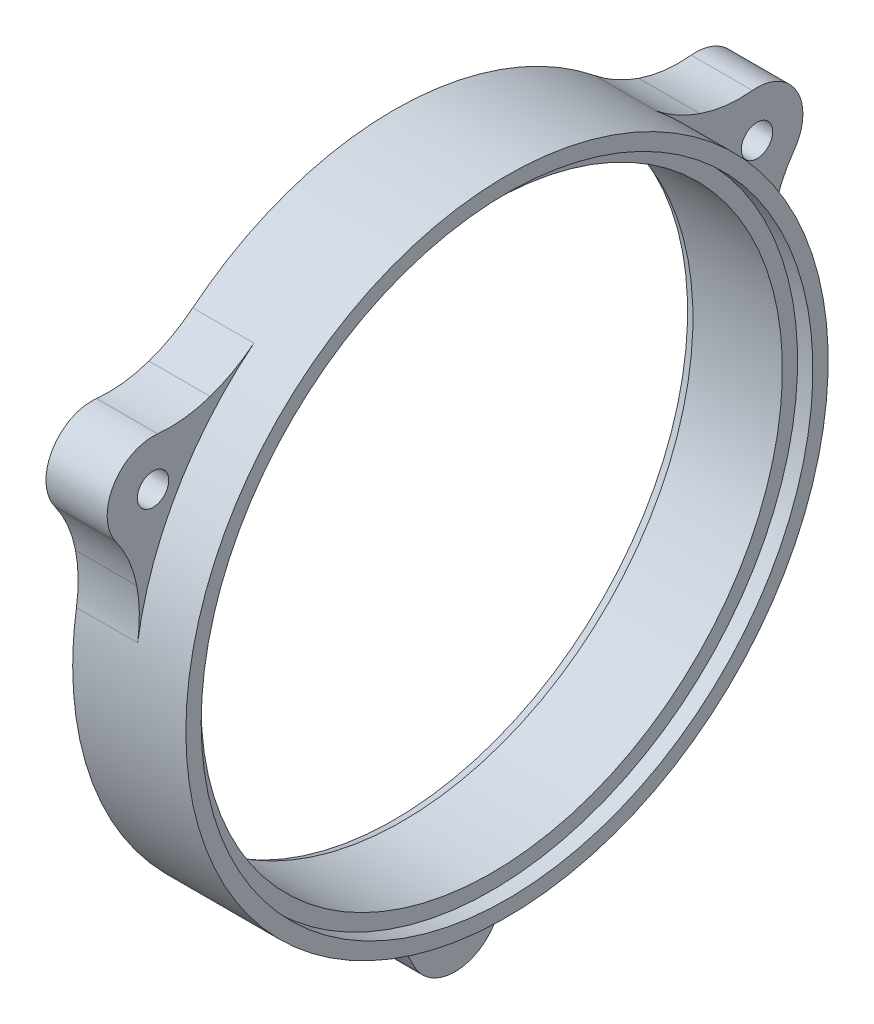
ISO-10303-21;
HEADER;
FILE_DESCRIPTION(('STEP AP214'),'2;1');
FILE_NAME('part.step','',(''),(''),'','','');
FILE_SCHEMA(('AUTOMOTIVE_DESIGN { 1 0 10303 214 1 1 1 1 }'));
ENDSEC;
DATA;
#1=APPLICATION_CONTEXT('core data for automotive mechanical design processes');
#2=APPLICATION_PROTOCOL_DEFINITION('international standard','automotive_design',2000,#1);
#3=PRODUCT_CONTEXT('',#1,'mechanical');
#4=PRODUCT('Part','Part','',(#3));
#5=PRODUCT_RELATED_PRODUCT_CATEGORY('part','',(#4));
#6=PRODUCT_DEFINITION_FORMATION('','',#4);
#7=PRODUCT_DEFINITION_CONTEXT('part definition',#1,'design');
#8=PRODUCT_DEFINITION('design','',#6,#7);
#9=PRODUCT_DEFINITION_SHAPE('','',#8);
#10=(LENGTH_UNIT() NAMED_UNIT(*) SI_UNIT(.MILLI.,.METRE.));
#11=(NAMED_UNIT(*) PLANE_ANGLE_UNIT() SI_UNIT($,.RADIAN.));
#12=(NAMED_UNIT(*) SI_UNIT($,.STERADIAN.) SOLID_ANGLE_UNIT());
#13=UNCERTAINTY_MEASURE_WITH_UNIT(LENGTH_MEASURE(1.E-05),#10,'distance_accuracy_value','');
#14=(GEOMETRIC_REPRESENTATION_CONTEXT(3) GLOBAL_UNCERTAINTY_ASSIGNED_CONTEXT((#13)) GLOBAL_UNIT_ASSIGNED_CONTEXT((#10,
#11,#12)) REPRESENTATION_CONTEXT('',''));
#15=CARTESIAN_POINT('',(0.,0.,0.));
#16=DIRECTION('',(0.,0.,1.));
#17=DIRECTION('',(1.,0.,0.));
#18=AXIS2_PLACEMENT_3D('',#15,#16,#17);
#19=CARTESIAN_POINT('',(0.,60.3504,0.));
#20=DIRECTION('',(1.,0.,0.));
#21=DIRECTION('',(0.,0.,-1.));
#22=AXIS2_PLACEMENT_3D('',#19,#20,#21);
#23=PLANE('',#22);
#24=CARTESIAN_POINT('',(0.,0.,0.));
#25=DIRECTION('',(1.,0.,0.));
#26=DIRECTION('',(0.,0.,-1.));
#27=AXIS2_PLACEMENT_3D('',#24,#25,#26);
#28=CIRCLE('',#27,60.9854);
#29=CARTESIAN_POINT('',(0.,0.,60.9854));
#30=VERTEX_POINT('',#29);
#31=EDGE_CURVE('E11',#30,#30,#28,.T.);
#32=ORIENTED_EDGE('',*,*,#31,.T.);
#33=EDGE_LOOP('',(#32));
#34=FACE_BOUND('',#33,.T.);
#35=CARTESIAN_POINT('',(0.,-72.39,5.27355936696949E-13));
#36=DIRECTION('',(-1.,0.,0.));
#37=DIRECTION('',(0.,0.,1.));
#38=AXIS2_PLACEMENT_3D('',#35,#36,#37);
#39=CIRCLE('',#38,3.2639);
#40=CARTESIAN_POINT('',(0.,-72.39,3.26390000000053));
#41=VERTEX_POINT('',#40);
#42=EDGE_CURVE('E331',#41,#41,#39,.T.);
#43=ORIENTED_EDGE('',*,*,#42,.F.);
#44=EDGE_LOOP('',(#43));
#45=FACE_BOUND('',#44,.T.);
#46=CARTESIAN_POINT('',(0.,36.1949999999998,-62.6915789799556));
#47=DIRECTION('',(-1.,0.,0.));
#48=DIRECTION('',(0.,0.,1.));
#49=AXIS2_PLACEMENT_3D('',#46,#47,#48);
#50=CIRCLE('',#49,3.2639);
#51=CARTESIAN_POINT('',(0.,36.1949999999998,-59.4276789799556));
#52=VERTEX_POINT('',#51);
#53=EDGE_CURVE('E250',#52,#52,#50,.T.);
#54=ORIENTED_EDGE('',*,*,#53,.F.);
#55=EDGE_LOOP('',(#54));
#56=FACE_BOUND('',#55,.T.);
#57=CARTESIAN_POINT('',(0.,0.,0.));
#58=DIRECTION('',(-1.,0.,0.));
#59=DIRECTION('',(0.,0.,1.));
#60=AXIS2_PLACEMENT_3D('',#57,#58,#59);
#61=CIRCLE('',#60,66.675);
#62=CARTESIAN_POINT('',(0.,10.1734653699422,-65.8942806878304));
#63=VERTEX_POINT('',#62);
#64=CARTESIAN_POINT('',(0.,-62.1528537247348,-24.1366608890236));
#65=VERTEX_POINT('',#64);
#66=EDGE_CURVE('E323',#63,#65,#61,.T.);
#67=ORIENTED_EDGE('',*,*,#66,.T.);
#68=CARTESIAN_POINT('',(0.,-90.5655868560422,-35.1705630097201));
#69=DIRECTION('',(1.,0.,0.));
#70=DIRECTION('',(0.,0.866025403784436,-0.500000000000004));
#71=AXIS2_PLACEMENT_3D('',#68,#69,#70);
#72=CIRCLE('',#71,30.4800000000001);
#73=CARTESIAN_POINT('',(0.,-67.5047313186697,-15.2399999999996));
#74=VERTEX_POINT('',#73);
#75=EDGE_CURVE('E240',#65,#74,#72,.T.);
#76=ORIENTED_EDGE('',*,*,#75,.T.);
#77=CARTESIAN_POINT('',(0.,-86.7221109331468,-31.8488025081));
#78=DIRECTION('',(1.,0.,0.));
#79=DIRECTION('',(0.,-0.866025403784436,0.500000000000004));
#80=AXIS2_PLACEMENT_3D('',#77,#78,#79);
#81=CIRCLE('',#80,25.4000000000001);
#82=CARTESIAN_POINT('',(0.,-76.2987575272218,-8.6860370476634));
#83=VERTEX_POINT('',#82);
#84=EDGE_CURVE('E243',#74,#83,#81,.T.);
#85=ORIENTED_EDGE('',*,*,#84,.T.);
#86=CARTESIAN_POINT('',(0.,-72.39,5.27355936696949E-13));
#87=DIRECTION('',(-1.,0.,0.));
#88=DIRECTION('',(0.,0.866025403784436,-0.500000000000004));
#89=AXIS2_PLACEMENT_3D('',#86,#87,#88);
#90=CIRCLE('',#89,9.52500000000012);
#91=CARTESIAN_POINT('',(0.,-76.2987575272218,8.6860370476644));
#92=VERTEX_POINT('',#91);
#93=EDGE_CURVE('E222',#83,#92,#90,.T.);
#94=ORIENTED_EDGE('',*,*,#93,.T.);
#95=CARTESIAN_POINT('',(0.,-86.7221109331463,31.848802508101));
#96=DIRECTION('',(1.,0.,0.));
#97=DIRECTION('',(0.,0.866025403784436,-0.500000000000004));
#98=AXIS2_PLACEMENT_3D('',#95,#96,#97);
#99=CIRCLE('',#98,25.4);
#100=CARTESIAN_POINT('',(0.,-67.5047313186694,15.2400000000005));
#101=VERTEX_POINT('',#100);
#102=EDGE_CURVE('E209',#92,#101,#99,.T.);
#103=ORIENTED_EDGE('',*,*,#102,.T.);
#104=CARTESIAN_POINT('',(0.,-90.5655868560417,35.1705630097211));
#105=DIRECTION('',(1.,0.,0.));
#106=DIRECTION('',(0.,-0.866025403784436,0.500000000000004));
#107=AXIS2_PLACEMENT_3D('',#104,#105,#106);
#108=CIRCLE('',#107,30.48);
#109=CARTESIAN_POINT('',(0.,-62.1528537247345,24.1366608890243));
#110=VERTEX_POINT('',#109);
#111=EDGE_CURVE('E56',#101,#110,#108,.T.);
#112=ORIENTED_EDGE('',*,*,#111,.T.);
#113=CARTESIAN_POINT('',(0.,10.173465369943,65.8942806878304));
#114=VERTEX_POINT('',#113);
#115=EDGE_CURVE('E326',#110,#114,#61,.T.);
#116=ORIENTED_EDGE('',*,*,#115,.T.);
#117=CARTESIAN_POINT('',(0.,14.8241923962027,96.0173804308386));
#118=DIRECTION('',(1.,0.,0.));
#119=DIRECTION('',(0.,-0.866025403784443,-0.499999999999992));
#120=AXIS2_PLACEMENT_3D('',#117,#118,#119);
#121=CIRCLE('',#120,30.4800000000001);
#122=CARTESIAN_POINT('',(0.,20.5541385056607,66.0808121976106));
#123=VERTEX_POINT('',#122);
#124=EDGE_CURVE('E203',#114,#123,#121,.T.);
#125=ORIENTED_EDGE('',*,*,#124,.T.);
#126=CARTESIAN_POINT('',(0.,15.7791834144456,91.0279523919672));
#127=DIRECTION('',(1.,0.,0.));
#128=DIRECTION('',(0.,0.866025403784443,0.499999999999992));
#129=AXIS2_PLACEMENT_3D('',#126,#127,#128);
#130=CIRCLE('',#129,25.4000000000001);
#131=CARTESIAN_POINT('',(0.,30.6270500221219,70.4196808195948));
#132=VERTEX_POINT('',#131);
#133=EDGE_CURVE('E186',#123,#132,#130,.T.);
#134=ORIENTED_EDGE('',*,*,#133,.T.);
#135=CARTESIAN_POINT('',(0.,36.1950000000007,62.6915789799551));
#136=DIRECTION('',(-1.,0.,0.));
#137=DIRECTION('',(0.,-0.866025403784443,-0.499999999999992));
#138=AXIS2_PLACEMENT_3D('',#135,#136,#137);
#139=CIRCLE('',#138,9.52500000000012);
#140=CARTESIAN_POINT('',(0.,45.6717075051013,61.7336437719308));
#141=VERTEX_POINT('',#140);
#142=EDGE_CURVE('E183',#132,#141,#139,.T.);
#143=ORIENTED_EDGE('',*,*,#142,.T.);
#144=CARTESIAN_POINT('',(0.,70.9429275187025,59.1791498838661));
#145=DIRECTION('',(1.,0.,0.));
#146=DIRECTION('',(0.,-0.866025403784443,-0.499999999999992));
#147=AXIS2_PLACEMENT_3D('',#144,#145,#146);
#148=CIRCLE('',#147,25.4);
#149=CARTESIAN_POINT('',(0.,46.9505928130102,50.8408121976102));
#150=VERTEX_POINT('',#149);
#151=EDGE_CURVE('E200',#141,#150,#148,.T.);
#152=ORIENTED_EDGE('',*,*,#151,.T.);
#153=CARTESIAN_POINT('',(0.,75.7413944598409,60.8468174211173));
#154=DIRECTION('',(1.,0.,0.));
#155=DIRECTION('',(0.,0.866025403784443,0.499999999999992));
#156=AXIS2_PLACEMENT_3D('',#153,#154,#155);
#157=CIRCLE('',#156,30.48);
#158=CARTESIAN_POINT('',(0.,51.9793883547928,41.757619798806));
#159=VERTEX_POINT('',#158);
#160=EDGE_CURVE('E49',#150,#159,#157,.T.);
#161=ORIENTED_EDGE('',*,*,#160,.T.);
#162=CARTESIAN_POINT('',(0.,51.9793883547924,-41.7576197988066));
#163=VERTEX_POINT('',#162);
#164=EDGE_CURVE('E322',#159,#163,#61,.T.);
#165=ORIENTED_EDGE('',*,*,#164,.T.);
#166=CARTESIAN_POINT('',(0.,75.7413944598402,-60.8468174211182));
#167=DIRECTION('',(1.,0.,0.));
#168=DIRECTION('',(0.,0.,1.));
#169=AXIS2_PLACEMENT_3D('',#166,#167,#168);
#170=CIRCLE('',#169,30.4800000000001);
#171=CARTESIAN_POINT('',(0.,46.9505928130095,-50.8408121976109));
#172=VERTEX_POINT('',#171);
#173=EDGE_CURVE('E289',#163,#172,#170,.T.);
#174=ORIENTED_EDGE('',*,*,#173,.T.);
#175=CARTESIAN_POINT('',(0.,70.9429275187018,-59.179149883867));
#176=DIRECTION('',(1.,0.,0.));
#177=DIRECTION('',(0.,0.,-1.));
#178=AXIS2_PLACEMENT_3D('',#175,#176,#177);
#179=CIRCLE('',#178,25.4000000000001);
#180=CARTESIAN_POINT('',(0.,45.6717075051005,-61.7336437719313));
#181=VERTEX_POINT('',#180);
#182=EDGE_CURVE('E292',#172,#181,#179,.T.);
#183=ORIENTED_EDGE('',*,*,#182,.T.);
#184=CARTESIAN_POINT('',(0.,36.1949999999998,-62.6915789799556));
#185=DIRECTION('',(-1.,0.,0.));
#186=DIRECTION('',(0.,0.,1.));
#187=AXIS2_PLACEMENT_3D('',#184,#185,#186);
#188=CIRCLE('',#187,9.52500000000012);
#189=CARTESIAN_POINT('',(0.,30.6270500221211,-70.4196808195953));
#190=VERTEX_POINT('',#189);
#191=EDGE_CURVE('E268',#181,#190,#188,.T.);
#192=ORIENTED_EDGE('',*,*,#191,.T.);
#193=CARTESIAN_POINT('',(0.,15.7791834144446,-91.0279523919674));
#194=DIRECTION('',(1.,0.,0.));
#195=DIRECTION('',(0.,0.,1.));
#196=AXIS2_PLACEMENT_3D('',#193,#194,#195);
#197=CIRCLE('',#196,25.4);
#198=CARTESIAN_POINT('',(0.,20.5541385056597,-66.0808121976109));
#199=VERTEX_POINT('',#198);
#200=EDGE_CURVE('E284',#190,#199,#197,.T.);
#201=ORIENTED_EDGE('',*,*,#200,.T.);
#202=CARTESIAN_POINT('',(0.,14.8241923962015,-96.0173804308387));
#203=DIRECTION('',(1.,0.,0.));
#204=DIRECTION('',(0.,0.,-1.));
#205=AXIS2_PLACEMENT_3D('',#202,#203,#204);
#206=CIRCLE('',#205,30.48);
#207=EDGE_CURVE('E287',#199,#63,#206,.T.);
#208=ORIENTED_EDGE('',*,*,#207,.T.);
#209=EDGE_LOOP('',(#67,#76,#85,#94,#103,#112,#116,#125,#134,#143,#152,#161,#165,#174,#183,#192,
#201,#208));
#210=FACE_BOUND('',#209,.T.);
#211=CARTESIAN_POINT('',(0.,36.1950000000007,62.6915789799551));
#212=DIRECTION('',(-1.,0.,0.));
#213=DIRECTION('',(0.,0.,1.));
#214=AXIS2_PLACEMENT_3D('',#211,#212,#213);
#215=CIRCLE('',#214,3.2639);
#216=CARTESIAN_POINT('',(0.,36.1950000000007,65.9554789799551));
#217=VERTEX_POINT('',#216);
#218=EDGE_CURVE('E332',#217,#217,#215,.T.);
#219=ORIENTED_EDGE('',*,*,#218,.F.);
#220=EDGE_LOOP('',(#219));
#221=FACE_BOUND('',#220,.T.);
#222=ADVANCED_FACE('F34',(#34,#45,#56,#210,#221),#23,.F.);
#223=CARTESIAN_POINT('',(0.,0.,0.));
#224=DIRECTION('',(-1.,0.,0.));
#225=DIRECTION('',(0.,0.,1.));
#226=AXIS2_PLACEMENT_3D('',#223,#224,#225);
#227=CYLINDRICAL_SURFACE('',#226,66.675);
#228=CARTESIAN_POINT('',(12.7,0.,0.));
#229=DIRECTION('',(1.,0.,0.));
#230=DIRECTION('',(0.,0.866025403784443,0.499999999999992));
#231=AXIS2_PLACEMENT_3D('',#228,#229,#230);
#232=CIRCLE('',#231,66.675);
#233=CARTESIAN_POINT('',(12.7,51.9793883547928,41.757619798806));
#234=VERTEX_POINT('',#233);
#235=CARTESIAN_POINT('',(12.7,10.173465369943,65.8942806878304));
#236=VERTEX_POINT('',#235);
#237=EDGE_CURVE('E179',#234,#236,#232,.T.);
#238=ORIENTED_EDGE('',*,*,#237,.T.);
#239=DIRECTION('',(-1.,0.,0.));
#240=VECTOR('',#239,1.);
#241=CARTESIAN_POINT('',(12.7,10.173465369943,65.8942806878304));
#242=LINE('',#241,#240);
#243=EDGE_CURVE('E214',#236,#114,#242,.T.);
#244=ORIENTED_EDGE('',*,*,#243,.T.);
#245=ORIENTED_EDGE('',*,*,#115,.F.);
#246=DIRECTION('',(-1.,0.,0.));
#247=VECTOR('',#246,1.);
#248=CARTESIAN_POINT('',(12.7,-62.1528537247345,24.1366608890243));
#249=LINE('',#248,#247);
#250=CARTESIAN_POINT('',(12.7,-62.1528537247345,24.1366608890243));
#251=VERTEX_POINT('',#250);
#252=EDGE_CURVE('E258',#251,#110,#249,.T.);
#253=ORIENTED_EDGE('',*,*,#252,.F.);
#254=CARTESIAN_POINT('',(12.7,0.,0.));
#255=DIRECTION('',(1.,0.,0.));
#256=DIRECTION('',(0.,-0.866025403784436,0.500000000000004));
#257=AXIS2_PLACEMENT_3D('',#254,#255,#256);
#258=CIRCLE('',#257,66.675);
#259=CARTESIAN_POINT('',(12.7,-62.1528537247348,-24.1366608890236));
#260=VERTEX_POINT('',#259);
#261=EDGE_CURVE('E225',#251,#260,#258,.T.);
#262=ORIENTED_EDGE('',*,*,#261,.T.);
#263=DIRECTION('',(-1.,0.,0.));
#264=VECTOR('',#263,1.);
#265=CARTESIAN_POINT('',(12.7,-62.1528537247348,-24.1366608890236));
#266=LINE('',#265,#264);
#267=EDGE_CURVE('E255',#260,#65,#266,.T.);
#268=ORIENTED_EDGE('',*,*,#267,.T.);
#269=ORIENTED_EDGE('',*,*,#66,.F.);
#270=DIRECTION('',(-1.,0.,0.));
#271=VECTOR('',#270,1.);
#272=CARTESIAN_POINT('',(12.7,10.1734653699422,-65.8942806878305));
#273=LINE('',#272,#271);
#274=CARTESIAN_POINT('',(12.7,10.1734653699422,-65.8942806878305));
#275=VERTEX_POINT('',#274);
#276=EDGE_CURVE('E307',#275,#63,#273,.T.);
#277=ORIENTED_EDGE('',*,*,#276,.F.);
#278=CARTESIAN_POINT('',(12.7,0.,0.));
#279=DIRECTION('',(1.,0.,0.));
#280=DIRECTION('',(0.,0.,-1.));
#281=AXIS2_PLACEMENT_3D('',#278,#279,#280);
#282=CIRCLE('',#281,66.675);
#283=CARTESIAN_POINT('',(12.7,51.9793883547924,-41.7576197988066));
#284=VERTEX_POINT('',#283);
#285=EDGE_CURVE('E271',#275,#284,#282,.T.);
#286=ORIENTED_EDGE('',*,*,#285,.T.);
#287=DIRECTION('',(-1.,0.,0.));
#288=VECTOR('',#287,1.);
#289=CARTESIAN_POINT('',(12.7,51.9793883547924,-41.7576197988066));
#290=LINE('',#289,#288);
#291=EDGE_CURVE('E304',#284,#163,#290,.T.);
#292=ORIENTED_EDGE('',*,*,#291,.T.);
#293=ORIENTED_EDGE('',*,*,#164,.F.);
#294=DIRECTION('',(-1.,0.,0.));
#295=VECTOR('',#294,1.);
#296=CARTESIAN_POINT('',(12.7,51.9793883547928,41.757619798806));
#297=LINE('',#296,#295);
#298=EDGE_CURVE('E168',#234,#159,#297,.T.);
#299=ORIENTED_EDGE('',*,*,#298,.F.);
#300=EDGE_LOOP('',(#238,#244,#245,#253,#262,#268,#269,#277,#286,#292,#293,#299));
#301=FACE_BOUND('',#300,.T.);
#302=CARTESIAN_POINT('',(23.495,0.,0.));
#303=DIRECTION('',(-1.,0.,0.));
#304=DIRECTION('',(0.,0.,1.));
#305=AXIS2_PLACEMENT_3D('',#302,#303,#304);
#306=CIRCLE('',#305,66.675);
#307=CARTESIAN_POINT('',(23.495,0.,66.675));
#308=VERTEX_POINT('',#307);
#309=EDGE_CURVE('E319',#308,#308,#306,.T.);
#310=ORIENTED_EDGE('',*,*,#309,.T.);
#311=EDGE_LOOP('',(#310));
#312=FACE_BOUND('',#311,.T.);
#313=ADVANCED_FACE('F350',(#301,#312),#227,.T.);
#314=CARTESIAN_POINT('',(23.495,66.675,0.));
#315=DIRECTION('',(-1.,0.,0.));
#316=DIRECTION('',(0.,0.,1.));
#317=AXIS2_PLACEMENT_3D('',#314,#315,#316);
#318=PLANE('',#317);
#319=ORIENTED_EDGE('',*,*,#309,.F.);
#320=EDGE_LOOP('',(#319));
#321=FACE_BOUND('',#320,.T.);
#322=CARTESIAN_POINT('',(23.495,0.,0.));
#323=DIRECTION('',(-1.,0.,0.));
#324=DIRECTION('',(0.,0.,1.));
#325=AXIS2_PLACEMENT_3D('',#322,#323,#324);
#326=CIRCLE('',#325,63.5);
#327=CARTESIAN_POINT('',(23.495,0.,63.5));
#328=VERTEX_POINT('',#327);
#329=EDGE_CURVE('E316',#328,#328,#326,.T.);
#330=ORIENTED_EDGE('',*,*,#329,.T.);
#331=EDGE_LOOP('',(#330));
#332=FACE_BOUND('',#331,.T.);
#333=ADVANCED_FACE('F355',(#321,#332),#318,.F.);
#334=CARTESIAN_POINT('',(0.,0.,0.));
#335=DIRECTION('',(-1.,0.,0.));
#336=DIRECTION('',(0.,0.,1.));
#337=AXIS2_PLACEMENT_3D('',#334,#335,#336);
#338=CYLINDRICAL_SURFACE('',#337,63.5);
#339=ORIENTED_EDGE('',*,*,#329,.F.);
#340=EDGE_LOOP('',(#339));
#341=FACE_BOUND('',#340,.T.);
#342=CARTESIAN_POINT('',(20.32,0.,0.));
#343=DIRECTION('',(-1.,0.,0.));
#344=DIRECTION('',(0.,0.,1.));
#345=AXIS2_PLACEMENT_3D('',#342,#343,#344);
#346=CIRCLE('',#345,63.5);
#347=CARTESIAN_POINT('',(20.32,0.,63.5));
#348=VERTEX_POINT('',#347);
#349=EDGE_CURVE('E313',#348,#348,#346,.T.);
#350=ORIENTED_EDGE('',*,*,#349,.T.);
#351=EDGE_LOOP('',(#350));
#352=FACE_BOUND('',#351,.T.);
#353=ADVANCED_FACE('F362',(#341,#352),#338,.F.);
#354=CARTESIAN_POINT('',(20.32,63.5,0.));
#355=DIRECTION('',(-1.,0.,0.));
#356=DIRECTION('',(0.,0.,1.));
#357=AXIS2_PLACEMENT_3D('',#354,#355,#356);
#358=PLANE('',#357);
#359=ORIENTED_EDGE('',*,*,#349,.F.);
#360=EDGE_LOOP('',(#359));
#361=FACE_BOUND('',#360,.T.);
#362=CARTESIAN_POINT('',(20.32,0.,0.));
#363=DIRECTION('',(-1.,0.,0.));
#364=DIRECTION('',(0.,0.,1.));
#365=AXIS2_PLACEMENT_3D('',#362,#363,#364);
#366=CIRCLE('',#365,60.3504);
#367=CARTESIAN_POINT('',(20.32,0.,60.3504));
#368=VERTEX_POINT('',#367);
#369=EDGE_CURVE('E299',#368,#368,#366,.T.);
#370=ORIENTED_EDGE('',*,*,#369,.T.);
#371=EDGE_LOOP('',(#370));
#372=FACE_BOUND('',#371,.T.);
#373=ADVANCED_FACE('F366',(#361,#372),#358,.F.);
#374=CARTESIAN_POINT('',(0.,0.,0.));
#375=DIRECTION('',(-1.,0.,0.));
#376=DIRECTION('',(0.,0.,1.));
#377=AXIS2_PLACEMENT_3D('',#374,#375,#376);
#378=CYLINDRICAL_SURFACE('',#377,60.3504);
#379=CARTESIAN_POINT('',(1.74464816135372,0.,0.));
#380=DIRECTION('',(1.,0.,0.));
#381=DIRECTION('',(0.,0.,-1.));
#382=AXIS2_PLACEMENT_3D('',#379,#380,#381);
#383=CIRCLE('',#382,60.3504);
#384=CARTESIAN_POINT('',(1.74464816135372,0.,60.3504));
#385=VERTEX_POINT('',#384);
#386=EDGE_CURVE('E42',#385,#385,#383,.F.);
#387=ORIENTED_EDGE('',*,*,#386,.T.);
#388=EDGE_LOOP('',(#387));
#389=FACE_BOUND('',#388,.T.);
#390=ORIENTED_EDGE('',*,*,#369,.F.);
#391=EDGE_LOOP('',(#390));
#392=FACE_BOUND('',#391,.T.);
#393=ADVANCED_FACE('F336',(#389,#392),#378,.F.);
#394=CARTESIAN_POINT('',(12.7,15.7791834144446,-91.0279523919674));
#395=DIRECTION('',(-1.,0.,0.));
#396=DIRECTION('',(0.,0.,1.));
#397=AXIS2_PLACEMENT_3D('',#394,#395,#396);
#398=CYLINDRICAL_SURFACE('',#397,25.4);
#399=ORIENTED_EDGE('',*,*,#200,.F.);
#400=DIRECTION('',(-1.,0.,0.));
#401=VECTOR('',#400,1.);
#402=CARTESIAN_POINT('',(12.7,30.6270500221211,-70.4196808195953));
#403=LINE('',#402,#401);
#404=CARTESIAN_POINT('',(12.7,30.6270500221211,-70.4196808195953));
#405=VERTEX_POINT('',#404);
#406=EDGE_CURVE('E297',#405,#190,#403,.T.);
#407=ORIENTED_EDGE('',*,*,#406,.F.);
#408=CARTESIAN_POINT('',(12.7,15.7791834144446,-91.0279523919674));
#409=DIRECTION('',(1.,0.,0.));
#410=DIRECTION('',(0.,0.,1.));
#411=AXIS2_PLACEMENT_3D('',#408,#409,#410);
#412=CIRCLE('',#411,25.4);
#413=CARTESIAN_POINT('',(12.7,20.5541385056597,-66.0808121976109));
#414=VERTEX_POINT('',#413);
#415=EDGE_CURVE('E264',#405,#414,#412,.T.);
#416=ORIENTED_EDGE('',*,*,#415,.T.);
#417=DIRECTION('',(-1.,0.,0.));
#418=VECTOR('',#417,1.);
#419=CARTESIAN_POINT('',(12.7,20.5541385056597,-66.0808121976109));
#420=LINE('',#419,#418);
#421=EDGE_CURVE('E283',#414,#199,#420,.T.);
#422=ORIENTED_EDGE('',*,*,#421,.T.);
#423=EDGE_LOOP('',(#399,#407,#416,#422));
#424=FACE_BOUND('',#423,.T.);
#425=ADVANCED_FACE('F373',(#424),#398,.F.);
#426=CARTESIAN_POINT('',(12.7,36.1949999999998,-62.6915789799556));
#427=DIRECTION('',(-1.,0.,0.));
#428=DIRECTION('',(0.,0.,1.));
#429=AXIS2_PLACEMENT_3D('',#426,#427,#428);
#430=CYLINDRICAL_SURFACE('',#429,9.52500000000012);
#431=ORIENTED_EDGE('',*,*,#191,.F.);
#432=DIRECTION('',(-1.,0.,0.));
#433=VECTOR('',#432,1.);
#434=CARTESIAN_POINT('',(12.7,45.6717075051005,-61.7336437719313));
#435=LINE('',#434,#433);
#436=CARTESIAN_POINT('',(12.7,45.6717075051005,-61.7336437719313));
#437=VERTEX_POINT('',#436);
#438=EDGE_CURVE('E300',#437,#181,#435,.T.);
#439=ORIENTED_EDGE('',*,*,#438,.F.);
#440=CARTESIAN_POINT('',(12.7,36.1949999999998,-62.6915789799556));
#441=DIRECTION('',(-1.,0.,0.));
#442=DIRECTION('',(0.,0.,1.));
#443=AXIS2_PLACEMENT_3D('',#440,#441,#442);
#444=CIRCLE('',#443,9.52500000000012);
#445=EDGE_CURVE('E280',#437,#405,#444,.T.);
#446=ORIENTED_EDGE('',*,*,#445,.T.);
#447=ORIENTED_EDGE('',*,*,#406,.T.);
#448=EDGE_LOOP('',(#431,#439,#446,#447));
#449=FACE_BOUND('',#448,.T.);
#450=ADVANCED_FACE('F376',(#449),#430,.T.);
#451=CARTESIAN_POINT('',(12.7,70.9429275187018,-59.179149883867));
#452=DIRECTION('',(-1.,0.,0.));
#453=DIRECTION('',(0.,0.,1.));
#454=AXIS2_PLACEMENT_3D('',#451,#452,#453);
#455=CYLINDRICAL_SURFACE('',#454,25.4000000000001);
#456=ORIENTED_EDGE('',*,*,#182,.F.);
#457=DIRECTION('',(-1.,0.,0.));
#458=VECTOR('',#457,1.);
#459=CARTESIAN_POINT('',(12.7,46.9505928130095,-50.8408121976109));
#460=LINE('',#459,#458);
#461=CARTESIAN_POINT('',(12.7,46.9505928130095,-50.8408121976109));
#462=VERTEX_POINT('',#461);
#463=EDGE_CURVE('E302',#462,#172,#460,.T.);
#464=ORIENTED_EDGE('',*,*,#463,.F.);
#465=CARTESIAN_POINT('',(12.7,70.9429275187018,-59.179149883867));
#466=DIRECTION('',(1.,0.,0.));
#467=DIRECTION('',(0.,0.,-1.));
#468=AXIS2_PLACEMENT_3D('',#465,#466,#467);
#469=CIRCLE('',#468,25.4000000000001);
#470=EDGE_CURVE('E277',#462,#437,#469,.T.);
#471=ORIENTED_EDGE('',*,*,#470,.T.);
#472=ORIENTED_EDGE('',*,*,#438,.T.);
#473=EDGE_LOOP('',(#456,#464,#471,#472));
#474=FACE_BOUND('',#473,.T.);
#475=ADVANCED_FACE('F386',(#474),#455,.F.);
#476=CARTESIAN_POINT('',(12.7,75.7413944598402,-60.8468174211182));
#477=DIRECTION('',(-1.,0.,0.));
#478=DIRECTION('',(0.,0.,1.));
#479=AXIS2_PLACEMENT_3D('',#476,#477,#478);
#480=CYLINDRICAL_SURFACE('',#479,30.4800000000001);
#481=ORIENTED_EDGE('',*,*,#173,.F.);
#482=ORIENTED_EDGE('',*,*,#291,.F.);
#483=CARTESIAN_POINT('',(12.7,75.7413944598402,-60.8468174211182));
#484=DIRECTION('',(1.,0.,0.));
#485=DIRECTION('',(0.,0.,1.));
#486=AXIS2_PLACEMENT_3D('',#483,#484,#485);
#487=CIRCLE('',#486,30.4800000000001);
#488=EDGE_CURVE('E274',#284,#462,#487,.T.);
#489=ORIENTED_EDGE('',*,*,#488,.T.);
#490=ORIENTED_EDGE('',*,*,#463,.T.);
#491=EDGE_LOOP('',(#481,#482,#489,#490));
#492=FACE_BOUND('',#491,.T.);
#493=ADVANCED_FACE('F382',(#492),#480,.F.);
#494=CARTESIAN_POINT('',(12.7,14.8241923962015,-96.0173804308387));
#495=DIRECTION('',(-1.,0.,0.));
#496=DIRECTION('',(0.,0.,1.));
#497=AXIS2_PLACEMENT_3D('',#494,#495,#496);
#498=CYLINDRICAL_SURFACE('',#497,30.48);
#499=ORIENTED_EDGE('',*,*,#207,.F.);
#500=ORIENTED_EDGE('',*,*,#421,.F.);
#501=CARTESIAN_POINT('',(12.7,14.8241923962015,-96.0173804308387));
#502=DIRECTION('',(1.,0.,0.));
#503=DIRECTION('',(0.,0.,-1.));
#504=AXIS2_PLACEMENT_3D('',#501,#502,#503);
#505=CIRCLE('',#504,30.48);
#506=EDGE_CURVE('E267',#414,#275,#505,.T.);
#507=ORIENTED_EDGE('',*,*,#506,.T.);
#508=ORIENTED_EDGE('',*,*,#276,.T.);
#509=EDGE_LOOP('',(#499,#500,#507,#508));
#510=FACE_BOUND('',#509,.T.);
#511=ADVANCED_FACE('F378',(#510),#498,.F.);
#512=CARTESIAN_POINT('',(12.7,25.9870917072222,-76.8597656859615));
#513=DIRECTION('',(-1.,0.,0.));
#514=DIRECTION('',(0.,0.,1.));
#515=AXIS2_PLACEMENT_3D('',#512,#513,#514);
#516=PLANE('',#515);
#517=CARTESIAN_POINT('',(12.7,36.1949999999998,-62.6915789799556));
#518=DIRECTION('',(-1.,0.,0.));
#519=DIRECTION('',(0.,0.,1.));
#520=AXIS2_PLACEMENT_3D('',#517,#518,#519);
#521=CIRCLE('',#520,3.2639);
#522=CARTESIAN_POINT('',(12.7,36.1949999999998,-59.4276789799556));
#523=VERTEX_POINT('',#522);
#524=EDGE_CURVE('E263',#523,#523,#521,.T.);
#525=ORIENTED_EDGE('',*,*,#524,.T.);
#526=EDGE_LOOP('',(#525));
#527=FACE_BOUND('',#526,.T.);
#528=ORIENTED_EDGE('',*,*,#415,.F.);
#529=ORIENTED_EDGE('',*,*,#445,.F.);
#530=ORIENTED_EDGE('',*,*,#470,.F.);
#531=ORIENTED_EDGE('',*,*,#488,.F.);
#532=ORIENTED_EDGE('',*,*,#285,.F.);
#533=ORIENTED_EDGE('',*,*,#506,.F.);
#534=EDGE_LOOP('',(#528,#529,#530,#531,#532,#533));
#535=FACE_BOUND('',#534,.T.);
#536=ADVANCED_FACE('F381',(#527,#535),#516,.F.);
#537=CARTESIAN_POINT('',(0.,36.1949999999998,-62.6915789799556));
#538=DIRECTION('',(-1.,0.,0.));
#539=DIRECTION('',(0.,0.,1.));
#540=AXIS2_PLACEMENT_3D('',#537,#538,#539);
#541=CYLINDRICAL_SURFACE('',#540,3.2639);
#542=ORIENTED_EDGE('',*,*,#53,.T.);
#543=EDGE_LOOP('',(#542));
#544=FACE_BOUND('',#543,.T.);
#545=ORIENTED_EDGE('',*,*,#524,.F.);
#546=EDGE_LOOP('',(#545));
#547=FACE_BOUND('',#546,.T.);
#548=ADVANCED_FACE('F396',(#544,#547),#541,.F.);
#549=CARTESIAN_POINT('',(12.7,-86.7221109331463,31.848802508101));
#550=DIRECTION('',(-1.,0.,0.));
#551=DIRECTION('',(0.,0.,1.));
#552=AXIS2_PLACEMENT_3D('',#549,#550,#551);
#553=CYLINDRICAL_SURFACE('',#552,25.4);
#554=ORIENTED_EDGE('',*,*,#102,.F.);
#555=DIRECTION('',(-1.,0.,0.));
#556=VECTOR('',#555,1.);
#557=CARTESIAN_POINT('',(12.7,-76.2987575272218,8.6860370476644));
#558=LINE('',#557,#556);
#559=CARTESIAN_POINT('',(12.7,-76.2987575272218,8.6860370476644));
#560=VERTEX_POINT('',#559);
#561=EDGE_CURVE('E248',#560,#92,#558,.T.);
#562=ORIENTED_EDGE('',*,*,#561,.F.);
#563=CARTESIAN_POINT('',(12.7,-86.7221109331463,31.848802508101));
#564=DIRECTION('',(1.,0.,0.));
#565=DIRECTION('',(0.,0.866025403784436,-0.500000000000004));
#566=AXIS2_PLACEMENT_3D('',#563,#564,#565);
#567=CIRCLE('',#566,25.4);
#568=CARTESIAN_POINT('',(12.7,-67.5047313186694,15.2400000000005));
#569=VERTEX_POINT('',#568);
#570=EDGE_CURVE('E218',#560,#569,#567,.T.);
#571=ORIENTED_EDGE('',*,*,#570,.T.);
#572=DIRECTION('',(-1.,0.,0.));
#573=VECTOR('',#572,1.);
#574=CARTESIAN_POINT('',(12.7,-67.5047313186694,15.2400000000005));
#575=LINE('',#574,#573);
#576=EDGE_CURVE('E237',#569,#101,#575,.T.);
#577=ORIENTED_EDGE('',*,*,#576,.T.);
#578=EDGE_LOOP('',(#554,#562,#571,#577));
#579=FACE_BOUND('',#578,.T.);
#580=ADVANCED_FACE('F400',(#579),#553,.F.);
#581=CARTESIAN_POINT('',(12.7,-72.39,5.27355936696949E-13));
#582=DIRECTION('',(-1.,0.,0.));
#583=DIRECTION('',(0.,0.,1.));
#584=AXIS2_PLACEMENT_3D('',#581,#582,#583);
#585=CYLINDRICAL_SURFACE('',#584,9.52500000000012);
#586=ORIENTED_EDGE('',*,*,#93,.F.);
#587=DIRECTION('',(-1.,0.,0.));
#588=VECTOR('',#587,1.);
#589=CARTESIAN_POINT('',(12.7,-76.2987575272218,-8.6860370476634));
#590=LINE('',#589,#588);
#591=CARTESIAN_POINT('',(12.7,-76.2987575272218,-8.6860370476634));
#592=VERTEX_POINT('',#591);
#593=EDGE_CURVE('E251',#592,#83,#590,.T.);
#594=ORIENTED_EDGE('',*,*,#593,.F.);
#595=CARTESIAN_POINT('',(12.7,-72.39,5.27355936696949E-13));
#596=DIRECTION('',(-1.,0.,0.));
#597=DIRECTION('',(0.,0.866025403784436,-0.500000000000004));
#598=AXIS2_PLACEMENT_3D('',#595,#596,#597);
#599=CIRCLE('',#598,9.52500000000012);
#600=EDGE_CURVE('E234',#592,#560,#599,.T.);
#601=ORIENTED_EDGE('',*,*,#600,.T.);
#602=ORIENTED_EDGE('',*,*,#561,.T.);
#603=EDGE_LOOP('',(#586,#594,#601,#602));
#604=FACE_BOUND('',#603,.T.);
#605=ADVANCED_FACE('F404',(#604),#585,.T.);
#606=CARTESIAN_POINT('',(12.7,-86.7221109331468,-31.8488025081));
#607=DIRECTION('',(-1.,0.,0.));
#608=DIRECTION('',(0.,0.,1.));
#609=AXIS2_PLACEMENT_3D('',#606,#607,#608);
#610=CYLINDRICAL_SURFACE('',#609,25.4000000000001);
#611=ORIENTED_EDGE('',*,*,#84,.F.);
#612=DIRECTION('',(-1.,0.,0.));
#613=VECTOR('',#612,1.);
#614=CARTESIAN_POINT('',(12.7,-67.5047313186697,-15.2399999999996));
#615=LINE('',#614,#613);
#616=CARTESIAN_POINT('',(12.7,-67.5047313186697,-15.2399999999996));
#617=VERTEX_POINT('',#616);
#618=EDGE_CURVE('E253',#617,#74,#615,.T.);
#619=ORIENTED_EDGE('',*,*,#618,.F.);
#620=CARTESIAN_POINT('',(12.7,-86.7221109331468,-31.8488025081));
#621=DIRECTION('',(1.,0.,0.));
#622=DIRECTION('',(0.,-0.866025403784436,0.500000000000004));
#623=AXIS2_PLACEMENT_3D('',#620,#621,#622);
#624=CIRCLE('',#623,25.4000000000001);
#625=EDGE_CURVE('E231',#617,#592,#624,.T.);
#626=ORIENTED_EDGE('',*,*,#625,.T.);
#627=ORIENTED_EDGE('',*,*,#593,.T.);
#628=EDGE_LOOP('',(#611,#619,#626,#627));
#629=FACE_BOUND('',#628,.T.);
#630=ADVANCED_FACE('F414',(#629),#610,.F.);
#631=CARTESIAN_POINT('',(12.7,-90.5655868560422,-35.1705630097201));
#632=DIRECTION('',(-1.,0.,0.));
#633=DIRECTION('',(0.,0.,1.));
#634=AXIS2_PLACEMENT_3D('',#631,#632,#633);
#635=CYLINDRICAL_SURFACE('',#634,30.4800000000001);
#636=ORIENTED_EDGE('',*,*,#75,.F.);
#637=ORIENTED_EDGE('',*,*,#267,.F.);
#638=CARTESIAN_POINT('',(12.7,-90.5655868560422,-35.1705630097201));
#639=DIRECTION('',(1.,0.,0.));
#640=DIRECTION('',(0.,0.866025403784436,-0.500000000000004));
#641=AXIS2_PLACEMENT_3D('',#638,#639,#640);
#642=CIRCLE('',#641,30.4800000000001);
#643=EDGE_CURVE('E228',#260,#617,#642,.T.);
#644=ORIENTED_EDGE('',*,*,#643,.T.);
#645=ORIENTED_EDGE('',*,*,#618,.T.);
#646=EDGE_LOOP('',(#636,#637,#644,#645));
#647=FACE_BOUND('',#646,.T.);
#648=ADVANCED_FACE('F410',(#647),#635,.F.);
#649=CARTESIAN_POINT('',(12.7,-90.5655868560417,35.1705630097211));
#650=DIRECTION('',(-1.,0.,0.));
#651=DIRECTION('',(0.,0.,1.));
#652=AXIS2_PLACEMENT_3D('',#649,#650,#651);
#653=CYLINDRICAL_SURFACE('',#652,30.48);
#654=ORIENTED_EDGE('',*,*,#111,.F.);
#655=ORIENTED_EDGE('',*,*,#576,.F.);
#656=CARTESIAN_POINT('',(12.7,-90.5655868560417,35.1705630097211));
#657=DIRECTION('',(1.,0.,0.));
#658=DIRECTION('',(0.,-0.866025403784436,0.500000000000004));
#659=AXIS2_PLACEMENT_3D('',#656,#657,#658);
#660=CIRCLE('',#659,30.48);
#661=EDGE_CURVE('E221',#569,#251,#660,.T.);
#662=ORIENTED_EDGE('',*,*,#661,.T.);
#663=ORIENTED_EDGE('',*,*,#252,.T.);
#664=EDGE_LOOP('',(#654,#655,#662,#663));
#665=FACE_BOUND('',#664,.T.);
#666=ADVANCED_FACE('F406',(#665),#653,.F.);
#667=CARTESIAN_POINT('',(12.7,-79.5560554665732,15.9244012540508));
#668=DIRECTION('',(-1.,0.,0.));
#669=DIRECTION('',(0.,0.866025403784436,-0.500000000000004));
#670=AXIS2_PLACEMENT_3D('',#667,#668,#669);
#671=PLANE('',#670);
#672=CARTESIAN_POINT('',(12.7,-72.39,5.27355936696949E-13));
#673=DIRECTION('',(-1.,0.,0.));
#674=DIRECTION('',(0.,0.,1.));
#675=AXIS2_PLACEMENT_3D('',#672,#673,#674);
#676=CIRCLE('',#675,3.2639);
#677=CARTESIAN_POINT('',(12.7,-72.39,3.26390000000053));
#678=VERTEX_POINT('',#677);
#679=EDGE_CURVE('E189',#678,#678,#676,.T.);
#680=ORIENTED_EDGE('',*,*,#679,.T.);
#681=EDGE_LOOP('',(#680));
#682=FACE_BOUND('',#681,.T.);
#683=ORIENTED_EDGE('',*,*,#570,.F.);
#684=ORIENTED_EDGE('',*,*,#600,.F.);
#685=ORIENTED_EDGE('',*,*,#625,.F.);
#686=ORIENTED_EDGE('',*,*,#643,.F.);
#687=ORIENTED_EDGE('',*,*,#261,.F.);
#688=ORIENTED_EDGE('',*,*,#661,.F.);
#689=EDGE_LOOP('',(#683,#684,#685,#686,#687,#688));
#690=FACE_BOUND('',#689,.T.);
#691=ADVANCED_FACE('F409',(#682,#690),#671,.F.);
#692=CARTESIAN_POINT('',(12.7,70.9429275187025,59.1791498838661));
#693=DIRECTION('',(-1.,0.,0.));
#694=DIRECTION('',(0.,0.,1.));
#695=AXIS2_PLACEMENT_3D('',#692,#693,#694);
#696=CYLINDRICAL_SURFACE('',#695,25.4);
#697=ORIENTED_EDGE('',*,*,#151,.F.);
#698=DIRECTION('',(-1.,0.,0.));
#699=VECTOR('',#698,1.);
#700=CARTESIAN_POINT('',(12.7,45.6717075051013,61.7336437719308));
#701=LINE('',#700,#699);
#702=CARTESIAN_POINT('',(12.7,45.6717075051013,61.7336437719308));
#703=VERTEX_POINT('',#702);
#704=EDGE_CURVE('E182',#703,#141,#701,.T.);
#705=ORIENTED_EDGE('',*,*,#704,.F.);
#706=CARTESIAN_POINT('',(12.7,70.9429275187025,59.1791498838661));
#707=DIRECTION('',(1.,0.,0.));
#708=DIRECTION('',(0.,-0.866025403784443,-0.499999999999992));
#709=AXIS2_PLACEMENT_3D('',#706,#707,#708);
#710=CIRCLE('',#709,25.4);
#711=CARTESIAN_POINT('',(12.7,46.9505928130102,50.8408121976102));
#712=VERTEX_POINT('',#711);
#713=EDGE_CURVE('E175',#703,#712,#710,.T.);
#714=ORIENTED_EDGE('',*,*,#713,.T.);
#715=DIRECTION('',(-1.,0.,0.));
#716=VECTOR('',#715,1.);
#717=CARTESIAN_POINT('',(12.7,46.9505928130102,50.8408121976102));
#718=LINE('',#717,#716);
#719=EDGE_CURVE('E160',#712,#150,#718,.T.);
#720=ORIENTED_EDGE('',*,*,#719,.T.);
#721=EDGE_LOOP('',(#697,#705,#714,#720));
#722=FACE_BOUND('',#721,.T.);
#723=ADVANCED_FACE('F181',(#722),#696,.F.);
#724=CARTESIAN_POINT('',(12.7,36.1950000000007,62.6915789799551));
#725=DIRECTION('',(-1.,0.,0.));
#726=DIRECTION('',(0.,0.,1.));
#727=AXIS2_PLACEMENT_3D('',#724,#725,#726);
#728=CYLINDRICAL_SURFACE('',#727,9.52500000000012);
#729=ORIENTED_EDGE('',*,*,#142,.F.);
#730=DIRECTION('',(-1.,0.,0.));
#731=VECTOR('',#730,1.);
#732=CARTESIAN_POINT('',(12.7,30.6270500221219,70.4196808195948));
#733=LINE('',#732,#731);
#734=CARTESIAN_POINT('',(12.7,30.6270500221219,70.4196808195948));
#735=VERTEX_POINT('',#734);
#736=EDGE_CURVE('E210',#735,#132,#733,.T.);
#737=ORIENTED_EDGE('',*,*,#736,.F.);
#738=CARTESIAN_POINT('',(12.7,36.1950000000007,62.6915789799551));
#739=DIRECTION('',(-1.,0.,0.));
#740=DIRECTION('',(0.,-0.866025403784443,-0.499999999999992));
#741=AXIS2_PLACEMENT_3D('',#738,#739,#740);
#742=CIRCLE('',#741,9.52500000000012);
#743=EDGE_CURVE('E169',#735,#703,#742,.T.);
#744=ORIENTED_EDGE('',*,*,#743,.T.);
#745=ORIENTED_EDGE('',*,*,#704,.T.);
#746=EDGE_LOOP('',(#729,#737,#744,#745));
#747=FACE_BOUND('',#746,.T.);
#748=ADVANCED_FACE('F427',(#747),#728,.T.);
#749=CARTESIAN_POINT('',(12.7,15.7791834144456,91.0279523919672));
#750=DIRECTION('',(-1.,0.,0.));
#751=DIRECTION('',(0.,0.,1.));
#752=AXIS2_PLACEMENT_3D('',#749,#750,#751);
#753=CYLINDRICAL_SURFACE('',#752,25.4000000000001);
#754=ORIENTED_EDGE('',*,*,#133,.F.);
#755=DIRECTION('',(-1.,0.,0.));
#756=VECTOR('',#755,1.);
#757=CARTESIAN_POINT('',(12.7,20.5541385056607,66.0808121976106));
#758=LINE('',#757,#756);
#759=CARTESIAN_POINT('',(12.7,20.5541385056607,66.0808121976106));
#760=VERTEX_POINT('',#759);
#761=EDGE_CURVE('E212',#760,#123,#758,.T.);
#762=ORIENTED_EDGE('',*,*,#761,.F.);
#763=CARTESIAN_POINT('',(12.7,15.7791834144456,91.0279523919672));
#764=DIRECTION('',(1.,0.,0.));
#765=DIRECTION('',(0.,0.866025403784443,0.499999999999992));
#766=AXIS2_PLACEMENT_3D('',#763,#764,#765);
#767=CIRCLE('',#766,25.4000000000001);
#768=EDGE_CURVE('E196',#760,#735,#767,.T.);
#769=ORIENTED_EDGE('',*,*,#768,.T.);
#770=ORIENTED_EDGE('',*,*,#736,.T.);
#771=EDGE_LOOP('',(#754,#762,#769,#770));
#772=FACE_BOUND('',#771,.T.);
#773=ADVANCED_FACE('F433',(#772),#753,.F.);
#774=CARTESIAN_POINT('',(12.7,14.8241923962027,96.0173804308386));
#775=DIRECTION('',(-1.,0.,0.));
#776=DIRECTION('',(0.,0.,1.));
#777=AXIS2_PLACEMENT_3D('',#774,#775,#776);
#778=CYLINDRICAL_SURFACE('',#777,30.4800000000001);
#779=ORIENTED_EDGE('',*,*,#124,.F.);
#780=ORIENTED_EDGE('',*,*,#243,.F.);
#781=CARTESIAN_POINT('',(12.7,14.8241923962027,96.0173804308386));
#782=DIRECTION('',(1.,0.,0.));
#783=DIRECTION('',(0.,-0.866025403784443,-0.499999999999992));
#784=AXIS2_PLACEMENT_3D('',#781,#782,#783);
#785=CIRCLE('',#784,30.4800000000001);
#786=EDGE_CURVE('E193',#236,#760,#785,.T.);
#787=ORIENTED_EDGE('',*,*,#786,.T.);
#788=ORIENTED_EDGE('',*,*,#761,.T.);
#789=EDGE_LOOP('',(#779,#780,#787,#788));
#790=FACE_BOUND('',#789,.T.);
#791=ADVANCED_FACE('F430',(#790),#778,.F.);
#792=CARTESIAN_POINT('',(12.7,75.7413944598409,60.8468174211173));
#793=DIRECTION('',(-1.,0.,0.));
#794=DIRECTION('',(0.,0.,1.));
#795=AXIS2_PLACEMENT_3D('',#792,#793,#794);
#796=CYLINDRICAL_SURFACE('',#795,30.48);
#797=ORIENTED_EDGE('',*,*,#160,.F.);
#798=ORIENTED_EDGE('',*,*,#719,.F.);
#799=CARTESIAN_POINT('',(12.7,75.7413944598409,60.8468174211173));
#800=DIRECTION('',(1.,0.,0.));
#801=DIRECTION('',(0.,0.866025403784443,0.499999999999992));
#802=AXIS2_PLACEMENT_3D('',#799,#800,#801);
#803=CIRCLE('',#802,30.48);
#804=EDGE_CURVE('E163',#712,#234,#803,.T.);
#805=ORIENTED_EDGE('',*,*,#804,.T.);
#806=ORIENTED_EDGE('',*,*,#298,.T.);
#807=EDGE_LOOP('',(#797,#798,#805,#806));
#808=FACE_BOUND('',#807,.T.);
#809=ADVANCED_FACE('F162',(#808),#796,.F.);
#810=CARTESIAN_POINT('',(12.7,53.5689637593516,60.9353644319106));
#811=DIRECTION('',(-1.,0.,0.));
#812=DIRECTION('',(0.,-0.866025403784443,-0.499999999999992));
#813=AXIS2_PLACEMENT_3D('',#810,#811,#812);
#814=PLANE('',#813);
#815=CARTESIAN_POINT('',(12.7,36.1950000000007,62.6915789799551));
#816=DIRECTION('',(-1.,0.,0.));
#817=DIRECTION('',(0.,0.,1.));
#818=AXIS2_PLACEMENT_3D('',#815,#816,#817);
#819=CIRCLE('',#818,3.2639);
#820=CARTESIAN_POINT('',(12.7,36.1950000000007,65.9554789799551));
#821=VERTEX_POINT('',#820);
#822=EDGE_CURVE('E329',#821,#821,#819,.T.);
#823=ORIENTED_EDGE('',*,*,#822,.T.);
#824=EDGE_LOOP('',(#823));
#825=FACE_BOUND('',#824,.T.);
#826=ORIENTED_EDGE('',*,*,#713,.F.);
#827=ORIENTED_EDGE('',*,*,#743,.F.);
#828=ORIENTED_EDGE('',*,*,#768,.F.);
#829=ORIENTED_EDGE('',*,*,#786,.F.);
#830=ORIENTED_EDGE('',*,*,#237,.F.);
#831=ORIENTED_EDGE('',*,*,#804,.F.);
#832=EDGE_LOOP('',(#826,#827,#828,#829,#830,#831));
#833=FACE_BOUND('',#832,.T.);
#834=ADVANCED_FACE('F173',(#825,#833),#814,.F.);
#835=CARTESIAN_POINT('',(0.,-72.39,5.27355936696949E-13));
#836=DIRECTION('',(-1.,0.,0.));
#837=DIRECTION('',(0.,0.,1.));
#838=AXIS2_PLACEMENT_3D('',#835,#836,#837);
#839=CYLINDRICAL_SURFACE('',#838,3.2639);
#840=ORIENTED_EDGE('',*,*,#42,.T.);
#841=EDGE_LOOP('',(#840));
#842=FACE_BOUND('',#841,.T.);
#843=ORIENTED_EDGE('',*,*,#679,.F.);
#844=EDGE_LOOP('',(#843));
#845=FACE_BOUND('',#844,.T.);
#846=ADVANCED_FACE('F345',(#842,#845),#839,.F.);
#847=CARTESIAN_POINT('',(0.,36.1950000000007,62.6915789799551));
#848=DIRECTION('',(-1.,0.,0.));
#849=DIRECTION('',(0.,0.,1.));
#850=AXIS2_PLACEMENT_3D('',#847,#848,#849);
#851=CYLINDRICAL_SURFACE('',#850,3.2639);
#852=ORIENTED_EDGE('',*,*,#218,.T.);
#853=EDGE_LOOP('',(#852));
#854=FACE_BOUND('',#853,.T.);
#855=ORIENTED_EDGE('',*,*,#822,.F.);
#856=EDGE_LOOP('',(#855));
#857=FACE_BOUND('',#856,.T.);
#858=ADVANCED_FACE('F340',(#854,#857),#851,.F.);
#859=CARTESIAN_POINT('',(1.74464816135372,0.,0.));
#860=DIRECTION('',(-1.,0.,0.));
#861=DIRECTION('',(0.,0.,1.));
#862=AXIS2_PLACEMENT_3D('',#859,#860,#861);
#863=CONICAL_SURFACE('',#862,60.3504,0.349065850398868);
#864=CARTESIAN_POINT('',(0.,0.,60.9854));
#865=CARTESIAN_POINT('',(0.0181734183474355,0.,60.9787854166667));
#866=CARTESIAN_POINT('',(0.0363468366948697,0.,60.9721708333333));
#867=CARTESIAN_POINT('',(0.0726936733897383,0.,60.9589416666667));
#868=CARTESIAN_POINT('',(0.0908670917371726,0.,60.9523270833333));
#869=CARTESIAN_POINT('',(0.127213928432042,0.,60.9390979166667));
#870=CARTESIAN_POINT('',(0.145387346779477,0.,60.9324833333333));
#871=CARTESIAN_POINT('',(0.181734183474346,0.,60.9192541666667));
#872=CARTESIAN_POINT('',(0.199907601821781,0.,60.9126395833333));
#873=CARTESIAN_POINT('',(0.23625443851665,0.,60.8994104166667));
#874=CARTESIAN_POINT('',(0.254427856864084,0.,60.8927958333333));
#875=CARTESIAN_POINT('',(0.290774693558953,0.,60.8795666666667));
#876=CARTESIAN_POINT('',(0.308948111906388,0.,60.8729520833333));
#877=CARTESIAN_POINT('',(0.345294948601258,0.,60.8597229166667));
#878=CARTESIAN_POINT('',(0.363468366948693,0.,60.8531083333333));
#879=CARTESIAN_POINT('',(0.399815203643562,0.,60.8398791666667));
#880=CARTESIAN_POINT('',(0.417988621990996,0.,60.8332645833333));
#881=CARTESIAN_POINT('',(0.454335458685865,0.,60.8200354166667));
#882=CARTESIAN_POINT('',(0.4725088770333,0.,60.8134208333333));
#883=CARTESIAN_POINT('',(0.508855713728169,0.,60.8001916666667));
#884=CARTESIAN_POINT('',(0.527029132075604,0.,60.7935770833333));
#885=CARTESIAN_POINT('',(0.563375968770473,0.,60.7803479166667));
#886=CARTESIAN_POINT('',(0.581549387117907,0.,60.7737333333333));
#887=CARTESIAN_POINT('',(0.617896223812776,0.,60.7605041666667));
#888=CARTESIAN_POINT('',(0.636069642160211,0.,60.7538895833333));
#889=CARTESIAN_POINT('',(0.672416478855081,0.,60.7406604166667));
#890=CARTESIAN_POINT('',(0.690589897202516,0.,60.7340458333333));
#891=CARTESIAN_POINT('',(0.726936733897385,0.,60.7208166666667));
#892=CARTESIAN_POINT('',(0.745110152244819,0.,60.7142020833333));
#893=CARTESIAN_POINT('',(0.781456988939688,0.,60.7009729166667));
#894=CARTESIAN_POINT('',(0.799630407287123,0.,60.6943583333333));
#895=CARTESIAN_POINT('',(0.835977243981992,0.,60.6811291666667));
#896=CARTESIAN_POINT('',(0.854150662329427,0.,60.6745145833333));
#897=CARTESIAN_POINT('',(0.890497499024296,0.,60.6612854166667));
#898=CARTESIAN_POINT('',(0.90867091737173,0.,60.6546708333333));
#899=CARTESIAN_POINT('',(0.9450177540666,0.,60.6414416666667));
#900=CARTESIAN_POINT('',(0.963191172414035,0.,60.6348270833333));
#901=CARTESIAN_POINT('',(0.999538009108905,0.,60.6215979166667));
#902=CARTESIAN_POINT('',(1.01771142745634,0.,60.6149833333333));
#903=CARTESIAN_POINT('',(1.05405826415121,0.,60.6017541666667));
#904=CARTESIAN_POINT('',(1.07223168249864,0.,60.5951395833333));
#905=CARTESIAN_POINT('',(1.10857851919351,0.,60.5819104166667));
#906=CARTESIAN_POINT('',(1.12675193754095,0.,60.5752958333333));
#907=CARTESIAN_POINT('',(1.16309877423582,0.,60.5620666666667));
#908=CARTESIAN_POINT('',(1.18127219258325,0.,60.5554520833333));
#909=CARTESIAN_POINT('',(1.21761902927812,0.,60.5422229166667));
#910=CARTESIAN_POINT('',(1.23579244762555,0.,60.5356083333333));
#911=CARTESIAN_POINT('',(1.27213928432042,0.,60.5223791666667));
#912=CARTESIAN_POINT('',(1.29031270266786,0.,60.5157645833333));
#913=CARTESIAN_POINT('',(1.32665953936273,0.,60.5025354166667));
#914=CARTESIAN_POINT('',(1.34483295771016,0.,60.4959208333333));
#915=CARTESIAN_POINT('',(1.38117979440503,0.,60.4826916666667));
#916=CARTESIAN_POINT('',(1.39935321275247,0.,60.4760770833333));
#917=CARTESIAN_POINT('',(1.43570004944733,0.,60.4628479166667));
#918=CARTESIAN_POINT('',(1.45387346779477,0.,60.4562333333333));
#919=CARTESIAN_POINT('',(1.49022030448964,0.,60.4430041666667));
#920=CARTESIAN_POINT('',(1.50839372283707,0.,60.4363895833333));
#921=CARTESIAN_POINT('',(1.54474055953194,0.,60.4231604166667));
#922=CARTESIAN_POINT('',(1.56291397787938,0.,60.4165458333333));
#923=CARTESIAN_POINT('',(1.59926081457425,0.,60.4033166666667));
#924=CARTESIAN_POINT('',(1.61743423292168,0.,60.3967020833333));
#925=CARTESIAN_POINT('',(1.65378106961655,0.,60.3834729166667));
#926=CARTESIAN_POINT('',(1.67195448796398,0.,60.3768583333333));
#927=CARTESIAN_POINT('',(1.70830132465885,0.,60.3636291666667));
#928=CARTESIAN_POINT('',(1.72647474300629,0.,60.3570145833333));
#929=CARTESIAN_POINT('',(1.74464816135372,0.,60.3504));
#930=B_SPLINE_CURVE_WITH_KNOTS('',3,(#864,#865,#866,#867,#868,#869,#870,#871,#872,#873,#874,
#875,#876,#877,#878,#879,#880,#881,#882,#883,#884,#885,#886,#887,#888,#889,#890,#891,#892,#893,
#894,#895,#896,#897,#898,#899,#900,#901,#902,#903,#904,#905,#906,#907,#908,#909,#910,#911,#912,
#913,#914,#915,#916,#917,#918,#919,#920,#921,#922,#923,#924,#925,#926,#927,#928,#929),
.UNSPECIFIED.,.F.,.F.,(4,2,2,2,2,2,2,2,2,2,2,2,2,2,2,2,2,2,2,2,2,2,2,2,2,2,2,2,2,2,2,2,4),(0.,
0.0580192435657368,0.116038487131476,0.174057730697213,0.232076974262949,0.290096217828688,
0.348115461394425,0.406134704960162,0.464153948525901,0.522173192091638,0.580192435657375,
0.638211679223114,0.696230922788851,0.754250166354588,0.812269409920327,0.870288653486063,
0.9283078970518,0.986327140617539,1.04434638418328,1.10236562774902,1.16038487131475,
1.21840411488049,1.27642335844623,1.33444260201196,1.3924618455777,1.45048108914344,
1.50850033270918,1.56651957627491,1.62453881984065,1.68255806340639,1.74057730697213,
1.79859655053786,1.8566157941036),.UNSPECIFIED.);
#931=EDGE_CURVE('BSEAM36',#30,#385,#930,.T.);
#932=ORIENTED_EDGE('',*,*,#31,.F.);
#933=ORIENTED_EDGE('',*,*,#386,.F.);
#934=ORIENTED_EDGE('',*,*,#931,.T.);
#935=ORIENTED_EDGE('',*,*,#931,.F.);
#936=EDGE_LOOP('',(#932,#934,#933,#935));
#937=FACE_BOUND('',#936,.T.);
#938=ADVANCED_FACE('F36',(#937),#863,.F.);
#939=CLOSED_SHELL('',(#222,#313,#333,#353,#373,#393,#425,#450,#475,#493,#511,#536,#548,#580,
#605,#630,#648,#666,#691,#723,#748,#773,#791,#809,#834,#846,#858,#938));
#940=MANIFOLD_SOLID_BREP('B2',#939);
#941=ADVANCED_BREP_SHAPE_REPRESENTATION('',(#18,#940),#14);
#942=SHAPE_DEFINITION_REPRESENTATION(#9,#941);
ENDSEC;
END-ISO-10303-21;
